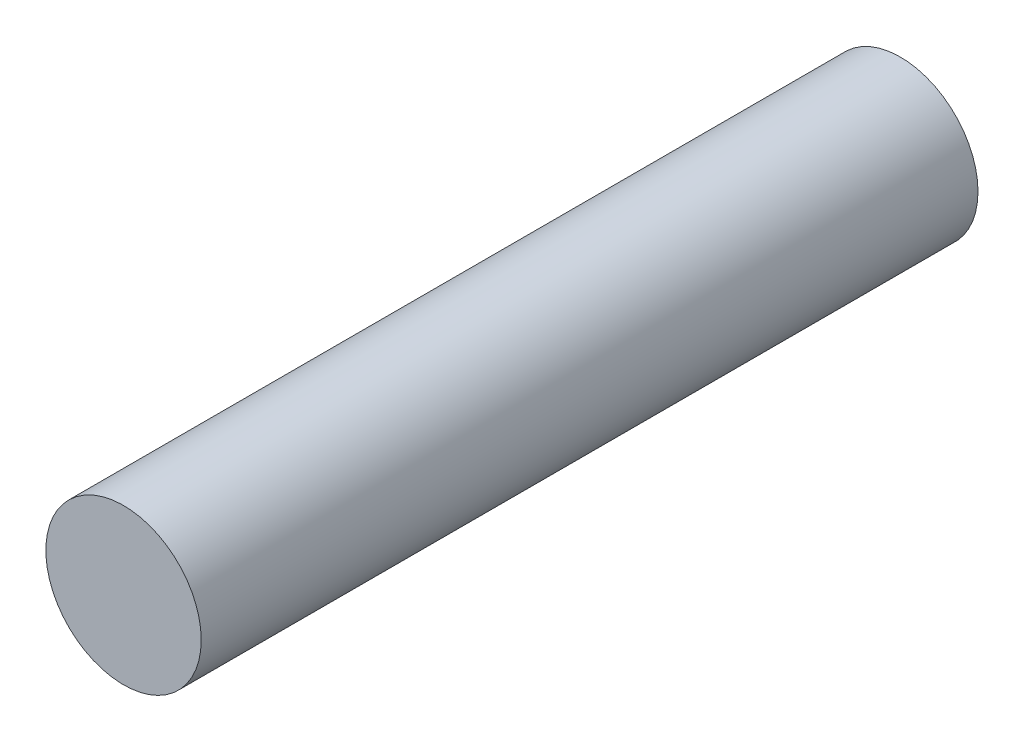
ISO-10303-21;
HEADER;
FILE_DESCRIPTION(('STEP AP214'),'2;1');
FILE_NAME('part.step','',(''),(''),'','','');
FILE_SCHEMA(('AUTOMOTIVE_DESIGN { 1 0 10303 214 1 1 1 1 }'));
ENDSEC;
DATA;
#1=APPLICATION_CONTEXT('core data for automotive mechanical design processes');
#2=APPLICATION_PROTOCOL_DEFINITION('international standard','automotive_design',2000,#1);
#3=PRODUCT_CONTEXT('',#1,'mechanical');
#4=PRODUCT('Part','Part','',(#3));
#5=PRODUCT_RELATED_PRODUCT_CATEGORY('part','',(#4));
#6=PRODUCT_DEFINITION_FORMATION('','',#4);
#7=PRODUCT_DEFINITION_CONTEXT('part definition',#1,'design');
#8=PRODUCT_DEFINITION('design','',#6,#7);
#9=PRODUCT_DEFINITION_SHAPE('','',#8);
#10=(LENGTH_UNIT() NAMED_UNIT(*) SI_UNIT(.MILLI.,.METRE.));
#11=(NAMED_UNIT(*) PLANE_ANGLE_UNIT() SI_UNIT($,.RADIAN.));
#12=(NAMED_UNIT(*) SI_UNIT($,.STERADIAN.) SOLID_ANGLE_UNIT());
#13=UNCERTAINTY_MEASURE_WITH_UNIT(LENGTH_MEASURE(1.E-05),#10,'distance_accuracy_value','');
#14=(GEOMETRIC_REPRESENTATION_CONTEXT(3) GLOBAL_UNCERTAINTY_ASSIGNED_CONTEXT((#13)) GLOBAL_UNIT_ASSIGNED_CONTEXT((#10,
#11,#12)) REPRESENTATION_CONTEXT('',''));
#15=CARTESIAN_POINT('',(0.,0.,0.));
#16=DIRECTION('',(0.,0.,1.));
#17=DIRECTION('',(1.,0.,0.));
#18=AXIS2_PLACEMENT_3D('',#15,#16,#17);
#19=CARTESIAN_POINT('',(0.,0.,150.));
#20=DIRECTION('',(0.,0.,-1.));
#21=DIRECTION('',(-1.,0.,0.));
#22=AXIS2_PLACEMENT_3D('',#19,#20,#21);
#23=CYLINDRICAL_SURFACE('',#22,15.);
#24=CARTESIAN_POINT('',(0.,0.,150.));
#25=DIRECTION('',(0.,0.,1.));
#26=DIRECTION('',(1.,0.,0.));
#27=AXIS2_PLACEMENT_3D('',#24,#25,#26);
#28=CIRCLE('',#27,15.);
#29=CARTESIAN_POINT('',(15.,0.,150.));
#30=VERTEX_POINT('',#29);
#31=EDGE_CURVE('E10',#30,#30,#28,.T.);
#32=ORIENTED_EDGE('',*,*,#31,.F.);
#33=EDGE_LOOP('',(#32));
#34=FACE_BOUND('',#33,.T.);
#35=CARTESIAN_POINT('',(0.,0.,0.));
#36=DIRECTION('',(0.,0.,1.));
#37=DIRECTION('',(1.,0.,0.));
#38=AXIS2_PLACEMENT_3D('',#35,#36,#37);
#39=CIRCLE('',#38,15.);
#40=CARTESIAN_POINT('',(15.,0.,0.));
#41=VERTEX_POINT('',#40);
#42=EDGE_CURVE('E42',#41,#41,#39,.T.);
#43=ORIENTED_EDGE('',*,*,#42,.T.);
#44=EDGE_LOOP('',(#43));
#45=FACE_BOUND('',#44,.T.);
#46=ADVANCED_FACE('F39',(#34,#45),#23,.T.);
#47=CARTESIAN_POINT('',(0.,0.,150.));
#48=DIRECTION('',(0.,0.,1.));
#49=DIRECTION('',(1.,0.,0.));
#50=AXIS2_PLACEMENT_3D('',#47,#48,#49);
#51=PLANE('',#50);
#52=ORIENTED_EDGE('',*,*,#31,.T.);
#53=EDGE_LOOP('',(#52));
#54=FACE_BOUND('',#53,.T.);
#55=ADVANCED_FACE('F54',(#54),#51,.T.);
#56=CARTESIAN_POINT('',(0.,0.,0.));
#57=DIRECTION('',(0.,0.,1.));
#58=DIRECTION('',(1.,0.,0.));
#59=AXIS2_PLACEMENT_3D('',#56,#57,#58);
#60=PLANE('',#59);
#61=ORIENTED_EDGE('',*,*,#42,.F.);
#62=EDGE_LOOP('',(#61));
#63=FACE_BOUND('',#62,.T.);
#64=ADVANCED_FACE('F52',(#63),#60,.F.);
#65=CLOSED_SHELL('',(#46,#55,#64));
#66=MANIFOLD_SOLID_BREP('B2',#65);
#67=ADVANCED_BREP_SHAPE_REPRESENTATION('',(#18,#66),#14);
#68=SHAPE_DEFINITION_REPRESENTATION(#9,#67);
ENDSEC;
END-ISO-10303-21;
